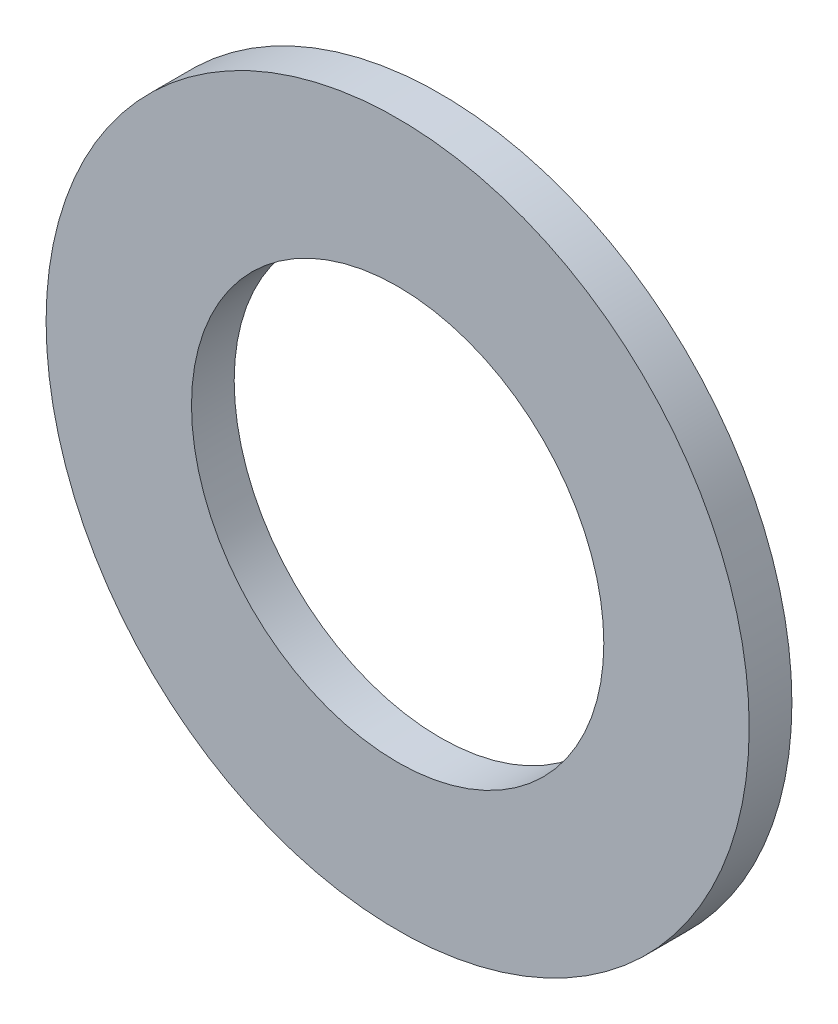
ISO-10303-21;
HEADER;
FILE_DESCRIPTION(('STEP AP214'),'2;1');
FILE_NAME('part.step','',(''),(''),'','','');
FILE_SCHEMA(('AUTOMOTIVE_DESIGN { 1 0 10303 214 1 1 1 1 }'));
ENDSEC;
DATA;
#1=APPLICATION_CONTEXT('core data for automotive mechanical design processes');
#2=APPLICATION_PROTOCOL_DEFINITION('international standard','automotive_design',2000,#1);
#3=PRODUCT_CONTEXT('',#1,'mechanical');
#4=PRODUCT('Part','Part','',(#3));
#5=PRODUCT_RELATED_PRODUCT_CATEGORY('part','',(#4));
#6=PRODUCT_DEFINITION_FORMATION('','',#4);
#7=PRODUCT_DEFINITION_CONTEXT('part definition',#1,'design');
#8=PRODUCT_DEFINITION('design','',#6,#7);
#9=PRODUCT_DEFINITION_SHAPE('','',#8);
#10=(LENGTH_UNIT() NAMED_UNIT(*) SI_UNIT(.MILLI.,.METRE.));
#11=(NAMED_UNIT(*) PLANE_ANGLE_UNIT() SI_UNIT($,.RADIAN.));
#12=(NAMED_UNIT(*) SI_UNIT($,.STERADIAN.) SOLID_ANGLE_UNIT());
#13=UNCERTAINTY_MEASURE_WITH_UNIT(LENGTH_MEASURE(1.E-05),#10,'distance_accuracy_value','');
#14=(GEOMETRIC_REPRESENTATION_CONTEXT(3) GLOBAL_UNCERTAINTY_ASSIGNED_CONTEXT((#13)) GLOBAL_UNIT_ASSIGNED_CONTEXT((#10,
#11,#12)) REPRESENTATION_CONTEXT('',''));
#15=CARTESIAN_POINT('',(0.,0.,0.));
#16=DIRECTION('',(0.,0.,1.));
#17=DIRECTION('',(1.,0.,0.));
#18=AXIS2_PLACEMENT_3D('',#15,#16,#17);
#19=CARTESIAN_POINT('',(0.,0.,1.45));
#20=DIRECTION('',(0.,0.,1.));
#21=DIRECTION('',(1.,0.,0.));
#22=AXIS2_PLACEMENT_3D('',#19,#20,#21);
#23=PLANE('',#22);
#24=CARTESIAN_POINT('',(0.,0.,1.45));
#25=DIRECTION('',(0.,0.,1.));
#26=DIRECTION('',(1.,0.,0.));
#27=AXIS2_PLACEMENT_3D('',#24,#25,#26);
#28=CIRCLE('',#27,11.9366207);
#29=CARTESIAN_POINT('',(11.9366207,0.,1.45));
#30=VERTEX_POINT('',#29);
#31=EDGE_CURVE('E10',#30,#30,#28,.T.);
#32=ORIENTED_EDGE('',*,*,#31,.T.);
#33=EDGE_LOOP('',(#32));
#34=FACE_BOUND('',#33,.T.);
#35=CARTESIAN_POINT('',(0.,0.,1.45));
#36=DIRECTION('',(0.,0.,1.));
#37=DIRECTION('',(1.,0.,0.));
#38=AXIS2_PLACEMENT_3D('',#35,#36,#37);
#39=CIRCLE('',#38,7.);
#40=CARTESIAN_POINT('',(7.,0.,1.45));
#41=VERTEX_POINT('',#40);
#42=EDGE_CURVE('E42',#41,#41,#39,.T.);
#43=ORIENTED_EDGE('',*,*,#42,.F.);
#44=EDGE_LOOP('',(#43));
#45=FACE_BOUND('',#44,.T.);
#46=ADVANCED_FACE('F31',(#34,#45),#23,.T.);
#47=CARTESIAN_POINT('',(0.,0.,0.));
#48=DIRECTION('',(0.,0.,1.));
#49=DIRECTION('',(1.,0.,0.));
#50=AXIS2_PLACEMENT_3D('',#47,#48,#49);
#51=PLANE('',#50);
#52=CARTESIAN_POINT('',(0.,0.,0.));
#53=DIRECTION('',(0.,0.,1.));
#54=DIRECTION('',(1.,0.,0.));
#55=AXIS2_PLACEMENT_3D('',#52,#53,#54);
#56=CIRCLE('',#55,11.9366207);
#57=CARTESIAN_POINT('',(11.9366207,0.,0.));
#58=VERTEX_POINT('',#57);
#59=EDGE_CURVE('E35',#58,#58,#56,.T.);
#60=ORIENTED_EDGE('',*,*,#59,.F.);
#61=EDGE_LOOP('',(#60));
#62=FACE_BOUND('',#61,.T.);
#63=CARTESIAN_POINT('',(0.,0.,0.));
#64=DIRECTION('',(0.,0.,1.));
#65=DIRECTION('',(1.,0.,0.));
#66=AXIS2_PLACEMENT_3D('',#63,#64,#65);
#67=CIRCLE('',#66,7.);
#68=CARTESIAN_POINT('',(7.,0.,0.));
#69=VERTEX_POINT('',#68);
#70=EDGE_CURVE('E44',#69,#69,#67,.T.);
#71=ORIENTED_EDGE('',*,*,#70,.T.);
#72=EDGE_LOOP('',(#71));
#73=FACE_BOUND('',#72,.T.);
#74=ADVANCED_FACE('F54',(#62,#73),#51,.F.);
#75=CARTESIAN_POINT('',(0.,0.,1.45));
#76=DIRECTION('',(0.,0.,-1.));
#77=DIRECTION('',(-1.,0.,0.));
#78=AXIS2_PLACEMENT_3D('',#75,#76,#77);
#79=CYLINDRICAL_SURFACE('',#78,11.9366207);
#80=ORIENTED_EDGE('',*,*,#31,.F.);
#81=EDGE_LOOP('',(#80));
#82=FACE_BOUND('',#81,.T.);
#83=ORIENTED_EDGE('',*,*,#59,.T.);
#84=EDGE_LOOP('',(#83));
#85=FACE_BOUND('',#84,.T.);
#86=ADVANCED_FACE('F33',(#82,#85),#79,.T.);
#87=CARTESIAN_POINT('',(0.,0.,1.45));
#88=DIRECTION('',(0.,0.,-1.));
#89=DIRECTION('',(-1.,0.,0.));
#90=AXIS2_PLACEMENT_3D('',#87,#88,#89);
#91=CYLINDRICAL_SURFACE('',#90,7.);
#92=ORIENTED_EDGE('',*,*,#42,.T.);
#93=EDGE_LOOP('',(#92));
#94=FACE_BOUND('',#93,.T.);
#95=ORIENTED_EDGE('',*,*,#70,.F.);
#96=EDGE_LOOP('',(#95));
#97=FACE_BOUND('',#96,.T.);
#98=ADVANCED_FACE('F50',(#94,#97),#91,.F.);
#99=CLOSED_SHELL('',(#46,#74,#86,#98));
#100=MANIFOLD_SOLID_BREP('B2',#99);
#101=ADVANCED_BREP_SHAPE_REPRESENTATION('',(#18,#100),#14);
#102=SHAPE_DEFINITION_REPRESENTATION(#9,#101);
ENDSEC;
END-ISO-10303-21;
